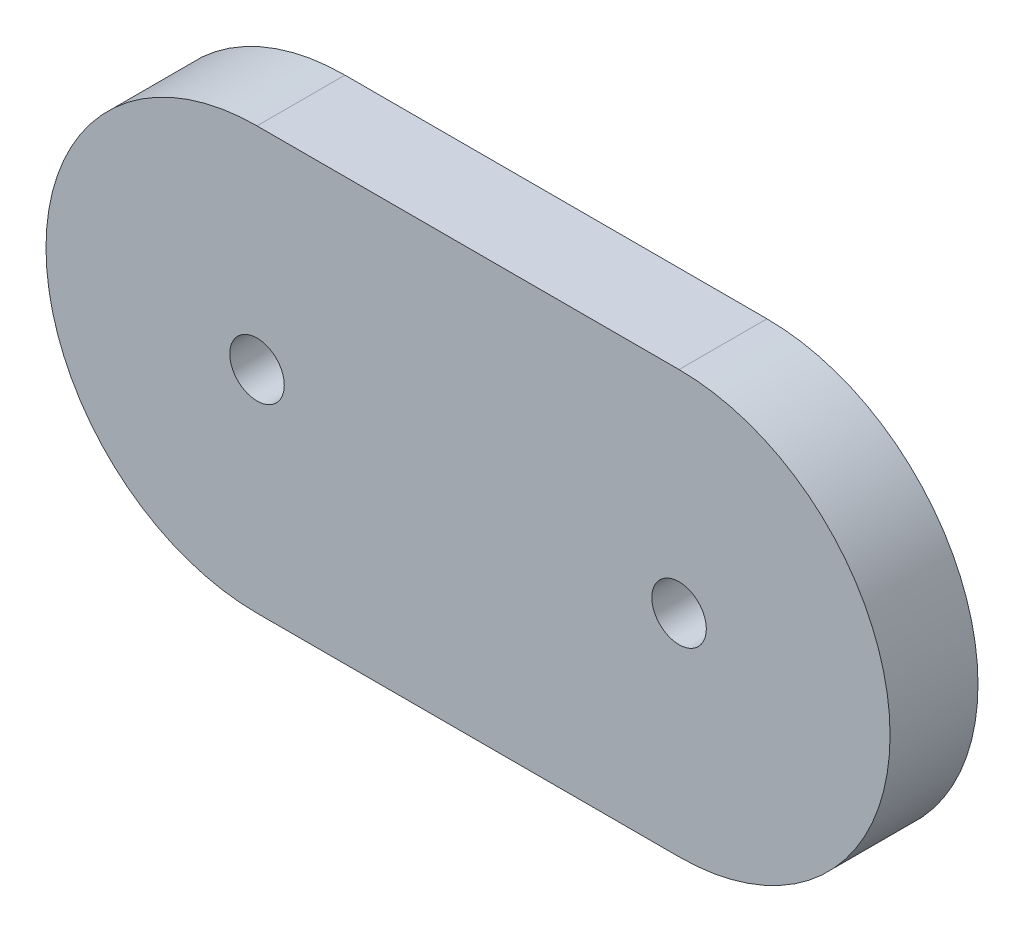
ISO-10303-21;
HEADER;
FILE_DESCRIPTION(('STEP AP214'),'2;1');
FILE_NAME('part.step','',(''),(''),'','','');
FILE_SCHEMA(('AUTOMOTIVE_DESIGN { 1 0 10303 214 1 1 1 1 }'));
ENDSEC;
DATA;
#1=APPLICATION_CONTEXT('core data for automotive mechanical design processes');
#2=APPLICATION_PROTOCOL_DEFINITION('international standard','automotive_design',2000,#1);
#3=PRODUCT_CONTEXT('',#1,'mechanical');
#4=PRODUCT('Part','Part','',(#3));
#5=PRODUCT_RELATED_PRODUCT_CATEGORY('part','',(#4));
#6=PRODUCT_DEFINITION_FORMATION('','',#4);
#7=PRODUCT_DEFINITION_CONTEXT('part definition',#1,'design');
#8=PRODUCT_DEFINITION('design','',#6,#7);
#9=PRODUCT_DEFINITION_SHAPE('','',#8);
#10=(LENGTH_UNIT() NAMED_UNIT(*) SI_UNIT(.MILLI.,.METRE.));
#11=(NAMED_UNIT(*) PLANE_ANGLE_UNIT() SI_UNIT($,.RADIAN.));
#12=(NAMED_UNIT(*) SI_UNIT($,.STERADIAN.) SOLID_ANGLE_UNIT());
#13=UNCERTAINTY_MEASURE_WITH_UNIT(LENGTH_MEASURE(1.E-05),#10,'distance_accuracy_value','');
#14=(GEOMETRIC_REPRESENTATION_CONTEXT(3) GLOBAL_UNCERTAINTY_ASSIGNED_CONTEXT((#13)) GLOBAL_UNIT_ASSIGNED_CONTEXT((#10,
#11,#12)) REPRESENTATION_CONTEXT('',''));
#15=CARTESIAN_POINT('',(0.,0.,0.));
#16=DIRECTION('',(0.,0.,1.));
#17=DIRECTION('',(1.,0.,0.));
#18=AXIS2_PLACEMENT_3D('',#15,#16,#17);
#19=CARTESIAN_POINT('',(0.,0.,5.));
#20=DIRECTION('',(0.,0.,-1.));
#21=DIRECTION('',(-1.,0.,0.));
#22=AXIS2_PLACEMENT_3D('',#19,#20,#21);
#23=CYLINDRICAL_SURFACE('',#22,12.);
#24=CARTESIAN_POINT('',(0.,0.,0.));
#25=DIRECTION('',(0.,0.,1.));
#26=DIRECTION('',(1.,0.,0.));
#27=AXIS2_PLACEMENT_3D('',#24,#25,#26);
#28=CIRCLE('',#27,12.);
#29=CARTESIAN_POINT('',(0.,12.,0.));
#30=VERTEX_POINT('',#29);
#31=CARTESIAN_POINT('',(0.,-12.,0.));
#32=VERTEX_POINT('',#31);
#33=EDGE_CURVE('E113',#30,#32,#28,.T.);
#34=ORIENTED_EDGE('',*,*,#33,.T.);
#35=DIRECTION('',(0.,0.,-1.));
#36=VECTOR('',#35,1.);
#37=CARTESIAN_POINT('',(0.,-12.,5.));
#38=LINE('',#37,#36);
#39=CARTESIAN_POINT('',(0.,-12.,5.));
#40=VERTEX_POINT('',#39);
#41=EDGE_CURVE('E11',#40,#32,#38,.T.);
#42=ORIENTED_EDGE('',*,*,#41,.F.);
#43=CARTESIAN_POINT('',(0.,0.,5.));
#44=DIRECTION('',(0.,0.,1.));
#45=DIRECTION('',(1.,0.,0.));
#46=AXIS2_PLACEMENT_3D('',#43,#44,#45);
#47=CIRCLE('',#46,12.);
#48=CARTESIAN_POINT('',(0.,12.,5.));
#49=VERTEX_POINT('',#48);
#50=EDGE_CURVE('E97',#49,#40,#47,.T.);
#51=ORIENTED_EDGE('',*,*,#50,.F.);
#52=DIRECTION('',(0.,0.,-1.));
#53=VECTOR('',#52,1.);
#54=CARTESIAN_POINT('',(0.,12.,5.));
#55=LINE('',#54,#53);
#56=EDGE_CURVE('E109',#49,#30,#55,.T.);
#57=ORIENTED_EDGE('',*,*,#56,.T.);
#58=EDGE_LOOP('',(#34,#42,#51,#57));
#59=FACE_BOUND('',#58,.T.);
#60=ADVANCED_FACE('F45',(#59),#23,.T.);
#61=CARTESIAN_POINT('',(0.,-12.,5.));
#62=DIRECTION('',(0.,1.,0.));
#63=DIRECTION('',(0.,0.,1.));
#64=AXIS2_PLACEMENT_3D('',#61,#62,#63);
#65=PLANE('',#64);
#66=DIRECTION('',(1.,0.,0.));
#67=VECTOR('',#66,1.);
#68=CARTESIAN_POINT('',(0.,-12.,0.));
#69=LINE('',#68,#67);
#70=CARTESIAN_POINT('',(24.,-12.,0.));
#71=VERTEX_POINT('',#70);
#72=EDGE_CURVE('E102',#32,#71,#69,.T.);
#73=ORIENTED_EDGE('',*,*,#72,.T.);
#74=DIRECTION('',(0.,0.,-1.));
#75=VECTOR('',#74,1.);
#76=CARTESIAN_POINT('',(24.,-12.,5.));
#77=LINE('',#76,#75);
#78=CARTESIAN_POINT('',(24.,-12.,5.));
#79=VERTEX_POINT('',#78);
#80=EDGE_CURVE('E54',#79,#71,#77,.T.);
#81=ORIENTED_EDGE('',*,*,#80,.F.);
#82=DIRECTION('',(1.,0.,0.));
#83=VECTOR('',#82,1.);
#84=CARTESIAN_POINT('',(0.,-12.,5.));
#85=LINE('',#84,#83);
#86=EDGE_CURVE('E92',#40,#79,#85,.T.);
#87=ORIENTED_EDGE('',*,*,#86,.F.);
#88=ORIENTED_EDGE('',*,*,#41,.T.);
#89=EDGE_LOOP('',(#73,#81,#87,#88));
#90=FACE_BOUND('',#89,.T.);
#91=ADVANCED_FACE('F101',(#90),#65,.F.);
#92=CARTESIAN_POINT('',(24.,0.,5.));
#93=DIRECTION('',(0.,0.,-1.));
#94=DIRECTION('',(-1.,0.,0.));
#95=AXIS2_PLACEMENT_3D('',#92,#93,#94);
#96=CYLINDRICAL_SURFACE('',#95,12.);
#97=CARTESIAN_POINT('',(24.,0.,0.));
#98=DIRECTION('',(0.,0.,1.));
#99=DIRECTION('',(1.,0.,0.));
#100=AXIS2_PLACEMENT_3D('',#97,#98,#99);
#101=CIRCLE('',#100,12.);
#102=CARTESIAN_POINT('',(24.,12.,0.));
#103=VERTEX_POINT('',#102);
#104=EDGE_CURVE('E79',#71,#103,#101,.T.);
#105=ORIENTED_EDGE('',*,*,#104,.T.);
#106=DIRECTION('',(0.,0.,-1.));
#107=VECTOR('',#106,1.);
#108=CARTESIAN_POINT('',(24.,12.,5.));
#109=LINE('',#108,#107);
#110=CARTESIAN_POINT('',(24.,12.,5.));
#111=VERTEX_POINT('',#110);
#112=EDGE_CURVE('E104',#111,#103,#109,.T.);
#113=ORIENTED_EDGE('',*,*,#112,.F.);
#114=CARTESIAN_POINT('',(24.,0.,5.));
#115=DIRECTION('',(0.,0.,1.));
#116=DIRECTION('',(1.,0.,0.));
#117=AXIS2_PLACEMENT_3D('',#114,#115,#116);
#118=CIRCLE('',#117,12.);
#119=EDGE_CURVE('E95',#79,#111,#118,.T.);
#120=ORIENTED_EDGE('',*,*,#119,.F.);
#121=ORIENTED_EDGE('',*,*,#80,.T.);
#122=EDGE_LOOP('',(#105,#113,#120,#121));
#123=FACE_BOUND('',#122,.T.);
#124=ADVANCED_FACE('F105',(#123),#96,.T.);
#125=CARTESIAN_POINT('',(0.,12.,5.));
#126=DIRECTION('',(0.,-1.,0.));
#127=DIRECTION('',(0.,0.,-1.));
#128=AXIS2_PLACEMENT_3D('',#125,#126,#127);
#129=PLANE('',#128);
#130=DIRECTION('',(-1.,0.,0.));
#131=VECTOR('',#130,1.);
#132=CARTESIAN_POINT('',(0.,12.,0.));
#133=LINE('',#132,#131);
#134=EDGE_CURVE('E85',#103,#30,#133,.T.);
#135=ORIENTED_EDGE('',*,*,#134,.T.);
#136=ORIENTED_EDGE('',*,*,#56,.F.);
#137=DIRECTION('',(-1.,0.,0.));
#138=VECTOR('',#137,1.);
#139=CARTESIAN_POINT('',(0.,12.,5.));
#140=LINE('',#139,#138);
#141=EDGE_CURVE('E62',#111,#49,#140,.T.);
#142=ORIENTED_EDGE('',*,*,#141,.F.);
#143=ORIENTED_EDGE('',*,*,#112,.T.);
#144=EDGE_LOOP('',(#135,#136,#142,#143));
#145=FACE_BOUND('',#144,.T.);
#146=ADVANCED_FACE('F127',(#145),#129,.F.);
#147=CARTESIAN_POINT('',(0.,0.,5.));
#148=DIRECTION('',(0.,0.,1.));
#149=DIRECTION('',(1.,0.,0.));
#150=AXIS2_PLACEMENT_3D('',#147,#148,#149);
#151=PLANE('',#150);
#152=CARTESIAN_POINT('',(0.,0.,5.));
#153=DIRECTION('',(0.,0.,1.));
#154=DIRECTION('',(1.,0.,0.));
#155=AXIS2_PLACEMENT_3D('',#152,#153,#154);
#156=CIRCLE('',#155,1.55);
#157=CARTESIAN_POINT('',(1.55,0.,5.));
#158=VERTEX_POINT('',#157);
#159=EDGE_CURVE('E117',#158,#158,#156,.T.);
#160=ORIENTED_EDGE('',*,*,#159,.F.);
#161=EDGE_LOOP('',(#160));
#162=FACE_BOUND('',#161,.T.);
#163=CARTESIAN_POINT('',(24.,0.,5.));
#164=DIRECTION('',(0.,0.,1.));
#165=DIRECTION('',(1.,0.,0.));
#166=AXIS2_PLACEMENT_3D('',#163,#164,#165);
#167=CIRCLE('',#166,1.55);
#168=CARTESIAN_POINT('',(25.55,0.,5.));
#169=VERTEX_POINT('',#168);
#170=EDGE_CURVE('E137',#169,#169,#167,.T.);
#171=ORIENTED_EDGE('',*,*,#170,.F.);
#172=EDGE_LOOP('',(#171));
#173=FACE_BOUND('',#172,.T.);
#174=ORIENTED_EDGE('',*,*,#50,.T.);
#175=ORIENTED_EDGE('',*,*,#86,.T.);
#176=ORIENTED_EDGE('',*,*,#119,.T.);
#177=ORIENTED_EDGE('',*,*,#141,.T.);
#178=EDGE_LOOP('',(#174,#175,#176,#177));
#179=FACE_BOUND('',#178,.T.);
#180=ADVANCED_FACE('F93',(#162,#173,#179),#151,.T.);
#181=CARTESIAN_POINT('',(0.,0.,0.));
#182=DIRECTION('',(0.,0.,1.));
#183=DIRECTION('',(1.,0.,0.));
#184=AXIS2_PLACEMENT_3D('',#181,#182,#183);
#185=PLANE('',#184);
#186=CARTESIAN_POINT('',(0.,0.,0.));
#187=DIRECTION('',(0.,0.,-1.));
#188=DIRECTION('',(-1.,0.,0.));
#189=AXIS2_PLACEMENT_3D('',#186,#187,#188);
#190=CIRCLE('',#189,1.55);
#191=CARTESIAN_POINT('',(-1.55,0.,0.));
#192=VERTEX_POINT('',#191);
#193=EDGE_CURVE('E141',#192,#192,#190,.T.);
#194=ORIENTED_EDGE('',*,*,#193,.F.);
#195=EDGE_LOOP('',(#194));
#196=FACE_BOUND('',#195,.T.);
#197=CARTESIAN_POINT('',(24.,0.,0.));
#198=DIRECTION('',(0.,0.,-1.));
#199=DIRECTION('',(-1.,0.,0.));
#200=AXIS2_PLACEMENT_3D('',#197,#198,#199);
#201=CIRCLE('',#200,1.55);
#202=CARTESIAN_POINT('',(22.45,0.,0.));
#203=VERTEX_POINT('',#202);
#204=EDGE_CURVE('E142',#203,#203,#201,.T.);
#205=ORIENTED_EDGE('',*,*,#204,.F.);
#206=EDGE_LOOP('',(#205));
#207=FACE_BOUND('',#206,.T.);
#208=ORIENTED_EDGE('',*,*,#33,.F.);
#209=ORIENTED_EDGE('',*,*,#134,.F.);
#210=ORIENTED_EDGE('',*,*,#104,.F.);
#211=ORIENTED_EDGE('',*,*,#72,.F.);
#212=EDGE_LOOP('',(#208,#209,#210,#211));
#213=FACE_BOUND('',#212,.T.);
#214=ADVANCED_FACE('F130',(#196,#207,#213),#185,.F.);
#215=CARTESIAN_POINT('',(24.,0.,12.));
#216=DIRECTION('',(0.,0.,-1.));
#217=DIRECTION('',(-1.,0.,0.));
#218=AXIS2_PLACEMENT_3D('',#215,#216,#217);
#219=CYLINDRICAL_SURFACE('',#218,1.55);
#220=ORIENTED_EDGE('',*,*,#170,.T.);
#221=EDGE_LOOP('',(#220));
#222=FACE_BOUND('',#221,.T.);
#223=ORIENTED_EDGE('',*,*,#204,.T.);
#224=EDGE_LOOP('',(#223));
#225=FACE_BOUND('',#224,.T.);
#226=ADVANCED_FACE('F154',(#222,#225),#219,.F.);
#227=CARTESIAN_POINT('',(0.,0.,12.));
#228=DIRECTION('',(0.,0.,-1.));
#229=DIRECTION('',(-1.,0.,0.));
#230=AXIS2_PLACEMENT_3D('',#227,#228,#229);
#231=CYLINDRICAL_SURFACE('',#230,1.55);
#232=ORIENTED_EDGE('',*,*,#159,.T.);
#233=EDGE_LOOP('',(#232));
#234=FACE_BOUND('',#233,.T.);
#235=ORIENTED_EDGE('',*,*,#193,.T.);
#236=EDGE_LOOP('',(#235));
#237=FACE_BOUND('',#236,.T.);
#238=ADVANCED_FACE('F150',(#234,#237),#231,.F.);
#239=CLOSED_SHELL('',(#60,#91,#124,#146,#180,#214,#226,#238));
#240=MANIFOLD_SOLID_BREP('B2',#239);
#241=ADVANCED_BREP_SHAPE_REPRESENTATION('',(#18,#240),#14);
#242=SHAPE_DEFINITION_REPRESENTATION(#9,#241);
ENDSEC;
END-ISO-10303-21;
